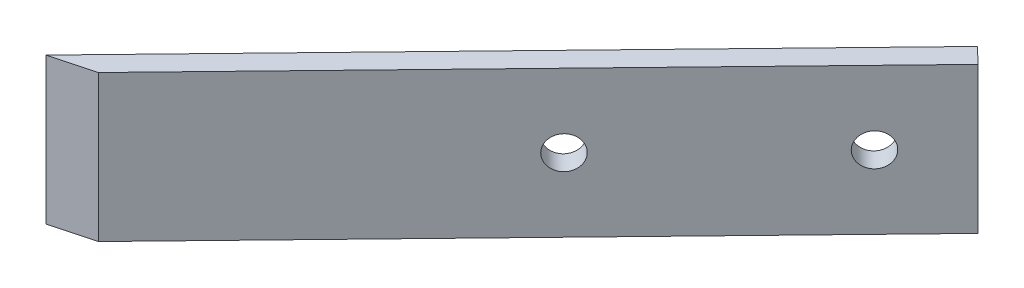
ISO-10303-21;
HEADER;
FILE_DESCRIPTION(('STEP AP214'),'2;1');
FILE_NAME('part.step','',(''),(''),'','','');
FILE_SCHEMA(('AUTOMOTIVE_DESIGN { 1 0 10303 214 1 1 1 1 }'));
ENDSEC;
DATA;
#1=APPLICATION_CONTEXT('core data for automotive mechanical design processes');
#2=APPLICATION_PROTOCOL_DEFINITION('international standard','automotive_design',2000,#1);
#3=PRODUCT_CONTEXT('',#1,'mechanical');
#4=PRODUCT('Part','Part','',(#3));
#5=PRODUCT_RELATED_PRODUCT_CATEGORY('part','',(#4));
#6=PRODUCT_DEFINITION_FORMATION('','',#4);
#7=PRODUCT_DEFINITION_CONTEXT('part definition',#1,'design');
#8=PRODUCT_DEFINITION('design','',#6,#7);
#9=PRODUCT_DEFINITION_SHAPE('','',#8);
#10=(LENGTH_UNIT() NAMED_UNIT(*) SI_UNIT(.MILLI.,.METRE.));
#11=(NAMED_UNIT(*) PLANE_ANGLE_UNIT() SI_UNIT($,.RADIAN.));
#12=(NAMED_UNIT(*) SI_UNIT($,.STERADIAN.) SOLID_ANGLE_UNIT());
#13=UNCERTAINTY_MEASURE_WITH_UNIT(LENGTH_MEASURE(1.E-05),#10,'distance_accuracy_value','');
#14=(GEOMETRIC_REPRESENTATION_CONTEXT(3) GLOBAL_UNCERTAINTY_ASSIGNED_CONTEXT((#13)) GLOBAL_UNIT_ASSIGNED_CONTEXT((#10,
#11,#12)) REPRESENTATION_CONTEXT('',''));
#15=CARTESIAN_POINT('',(0.,0.,0.));
#16=DIRECTION('',(0.,0.,1.));
#17=DIRECTION('',(1.,0.,0.));
#18=AXIS2_PLACEMENT_3D('',#15,#16,#17);
#19=CARTESIAN_POINT('',(-830.5061192892,-2000.,2737.529525084));
#20=DIRECTION('',(-0.718373918296144,0.,-0.69565718102514));
#21=DIRECTION('',(-0.69565718102514,0.,0.718373918296145));
#22=AXIS2_PLACEMENT_3D('',#19,#20,#21);
#23=CYLINDRICAL_SURFACE('',#22,4.5);
#24=CARTESIAN_POINT('',(-830.4342818974,-2000.,2737.599090802));
#25=DIRECTION('',(-0.718373918296144,0.,-0.69565718102514));
#26=DIRECTION('',(-0.69565718102514,0.,0.718373918296145));
#27=AXIS2_PLACEMENT_3D('',#24,#25,#26);
#28=CIRCLE('',#27,4.5);
#29=CARTESIAN_POINT('',(-833.564739212,-2000.,2740.831773434));
#30=VERTEX_POINT('',#29);
#31=EDGE_CURVE('E123',#30,#30,#28,.T.);
#32=ORIENTED_EDGE('',*,*,#31,.T.);
#33=DIRECTION('',(0.718373918296145,0.,0.69565718102514));
#34=VECTOR('',#33,1.);
#35=CARTESIAN_POINT('',(-833.6365766039,-2000.,2740.762207716));
#36=LINE('',#35,#34);
#37=CARTESIAN_POINT('',(-829.2544957022,-2000.,2745.00571652));
#38=VERTEX_POINT('',#37);
#39=EDGE_CURVE('E11',#30,#38,#36,.T.);
#40=ORIENTED_EDGE('',*,*,#39,.T.);
#41=CARTESIAN_POINT('',(-826.1240383876,-2000.,2741.773033888));
#42=DIRECTION('',(-0.718373918296144,0.,-0.69565718102514));
#43=DIRECTION('',(-0.69565718102514,0.,0.718373918296145));
#44=AXIS2_PLACEMENT_3D('',#41,#42,#43);
#45=CIRCLE('',#44,4.5);
#46=EDGE_CURVE('E143',#38,#38,#45,.T.);
#47=ORIENTED_EDGE('',*,*,#46,.F.);
#48=ORIENTED_EDGE('',*,*,#39,.F.);
#49=EDGE_LOOP('',(#32,#40,#47,#48));
#50=FACE_BOUND('',#49,.T.);
#51=ADVANCED_FACE('F17',(#50),#23,.F.);
#52=CARTESIAN_POINT('',(-788.7666884277,-2000.,2694.427089986));
#53=DIRECTION('',(-0.718373918296144,0.,-0.69565718102514));
#54=DIRECTION('',(-0.69565718102514,0.,0.718373918296145));
#55=AXIS2_PLACEMENT_3D('',#52,#53,#54);
#56=CYLINDRICAL_SURFACE('',#55,4.5);
#57=CARTESIAN_POINT('',(-788.6948510359,-2000.,2694.496655704));
#58=DIRECTION('',(-0.718373918296144,0.,-0.69565718102514));
#59=DIRECTION('',(-0.69565718102514,0.,0.718373918296145));
#60=AXIS2_PLACEMENT_3D('',#57,#58,#59);
#61=CIRCLE('',#60,4.5);
#62=CARTESIAN_POINT('',(-791.8253083505,-2000.,2697.729338336));
#63=VERTEX_POINT('',#62);
#64=EDGE_CURVE('E130',#63,#63,#61,.T.);
#65=ORIENTED_EDGE('',*,*,#64,.T.);
#66=DIRECTION('',(0.718373918296145,0.,0.69565718102514));
#67=VECTOR('',#66,1.);
#68=CARTESIAN_POINT('',(-791.8971457423,-2000.,2697.659772618));
#69=LINE('',#68,#67);
#70=CARTESIAN_POINT('',(-787.5150648407,-2000.,2701.903281422));
#71=VERTEX_POINT('',#70);
#72=EDGE_CURVE('E26',#63,#71,#69,.T.);
#73=ORIENTED_EDGE('',*,*,#72,.T.);
#74=CARTESIAN_POINT('',(-784.3846075261,-2000.,2698.67059879));
#75=DIRECTION('',(-0.718373918296144,0.,-0.69565718102514));
#76=DIRECTION('',(-0.69565718102514,0.,0.718373918296145));
#77=AXIS2_PLACEMENT_3D('',#74,#75,#76);
#78=CIRCLE('',#77,4.5);
#79=EDGE_CURVE('E128',#71,#71,#78,.T.);
#80=ORIENTED_EDGE('',*,*,#79,.F.);
#81=ORIENTED_EDGE('',*,*,#72,.F.);
#82=EDGE_LOOP('',(#65,#73,#80,#81));
#83=FACE_BOUND('',#82,.T.);
#84=ADVANCED_FACE('F169',(#83),#56,.F.);
#85=CARTESIAN_POINT('',(-46.716837641,0.,2580.799948362));
#86=DIRECTION('',(-0.258819045102985,0.,-0.965925826288944));
#87=DIRECTION('',(-0.965925826288944,0.,0.258819045102985));
#88=AXIS2_PLACEMENT_3D('',#85,#86,#87);
#89=PLANE('',#88);
#90=DIRECTION('',(0.,1.,0.));
#91=VECTOR('',#90,1.);
#92=CARTESIAN_POINT('',(-888.7212350275,-990.,2806.414346665));
#93=LINE('',#92,#91);
#94=CARTESIAN_POINT('',(-888.7212350275,-2020.,2806.414346665));
#95=VERTEX_POINT('',#94);
#96=CARTESIAN_POINT('',(-888.7212350275,-1980.,2806.414346665));
#97=VERTEX_POINT('',#96);
#98=EDGE_CURVE('E126',#95,#97,#93,.T.);
#99=ORIENTED_EDGE('',*,*,#98,.T.);
#100=DIRECTION('',(0.965925826288944,0.,-0.258819045102985));
#101=VECTOR('',#100,1.);
#102=CARTESIAN_POINT('',(-398.7798769135,-1980.,2675.13495542));
#103=LINE('',#102,#101);
#104=CARTESIAN_POINT('',(-900.,-1980.,2809.436482631));
#105=VERTEX_POINT('',#104);
#106=EDGE_CURVE('E94',#105,#97,#103,.T.);
#107=ORIENTED_EDGE('',*,*,#106,.F.);
#108=DIRECTION('',(0.,-1.,0.));
#109=VECTOR('',#108,1.);
#110=CARTESIAN_POINT('',(-900.,-1980.,2809.436482631));
#111=LINE('',#110,#109);
#112=CARTESIAN_POINT('',(-900.,-2020.,2809.436482631));
#113=VERTEX_POINT('',#112);
#114=EDGE_CURVE('E133',#105,#113,#111,.T.);
#115=ORIENTED_EDGE('',*,*,#114,.T.);
#116=DIRECTION('',(0.965925826288944,0.,-0.258819045102985));
#117=VECTOR('',#116,1.);
#118=CARTESIAN_POINT('',(-398.7798769135,-2020.,2675.13495542));
#119=LINE('',#118,#117);
#120=EDGE_CURVE('E147',#113,#95,#119,.T.);
#121=ORIENTED_EDGE('',*,*,#120,.T.);
#122=EDGE_LOOP('',(#99,#107,#115,#121));
#123=FACE_BOUND('',#122,.T.);
#124=ADVANCED_FACE('F19',(#123),#89,.F.);
#125=CARTESIAN_POINT('',(-774.7817074154,-1980.,2680.129177338));
#126=DIRECTION('',(0.718373918296145,0.,0.69565718102514));
#127=DIRECTION('',(0.,-1.,0.));
#128=AXIS2_PLACEMENT_3D('',#125,#126,#127);
#129=PLANE('',#128);
#130=ORIENTED_EDGE('',*,*,#31,.F.);
#131=EDGE_LOOP('',(#130));
#132=FACE_BOUND('',#131,.T.);
#133=ORIENTED_EDGE('',*,*,#64,.F.);
#134=EDGE_LOOP('',(#133));
#135=FACE_BOUND('',#134,.T.);
#136=DIRECTION('',(-0.69565718102514,0.,0.718373918296145));
#137=VECTOR('',#136,1.);
#138=CARTESIAN_POINT('',(-774.7817074154,-2020.,2680.129177338));
#139=LINE('',#138,#137);
#140=CARTESIAN_POINT('',(-774.7817074154,-2020.,2680.129177338));
#141=VERTEX_POINT('',#140);
#142=EDGE_CURVE('E150',#141,#113,#139,.T.);
#143=ORIENTED_EDGE('',*,*,#142,.T.);
#144=ORIENTED_EDGE('',*,*,#114,.F.);
#145=DIRECTION('',(-0.69565718102514,0.,0.718373918296145));
#146=VECTOR('',#145,1.);
#147=CARTESIAN_POINT('',(-774.7817074154,-1980.,2680.129177338));
#148=LINE('',#147,#146);
#149=CARTESIAN_POINT('',(-774.7817074154,-1980.,2680.129177338));
#150=VERTEX_POINT('',#149);
#151=EDGE_CURVE('E99',#150,#105,#148,.T.);
#152=ORIENTED_EDGE('',*,*,#151,.F.);
#153=DIRECTION('',(0.,-1.,0.));
#154=VECTOR('',#153,1.);
#155=CARTESIAN_POINT('',(-774.7817074154,-1980.,2680.129177338));
#156=LINE('',#155,#154);
#157=EDGE_CURVE('E107',#150,#141,#156,.T.);
#158=ORIENTED_EDGE('',*,*,#157,.T.);
#159=EDGE_LOOP('',(#143,#144,#152,#158));
#160=FACE_BOUND('',#159,.T.);
#161=ADVANCED_FACE('F159',(#132,#135,#160),#129,.F.);
#162=CARTESIAN_POINT('',(-774.7817074154,-2020.,2680.129177338));
#163=DIRECTION('',(0.,-1.,0.));
#164=DIRECTION('',(0.,0.,-1.));
#165=AXIS2_PLACEMENT_3D('',#162,#163,#164);
#166=PLANE('',#165);
#167=ORIENTED_EDGE('',*,*,#120,.F.);
#168=ORIENTED_EDGE('',*,*,#142,.F.);
#169=DIRECTION('',(0.718373918296145,0.,0.69565718102514));
#170=VECTOR('',#169,1.);
#171=CARTESIAN_POINT('',(-774.7817074154,-2020.,2680.129177338));
#172=LINE('',#171,#170);
#173=CARTESIAN_POINT('',(-770.4714639056,-2020.,2684.303120424));
#174=VERTEX_POINT('',#173);
#175=EDGE_CURVE('E115',#141,#174,#172,.T.);
#176=ORIENTED_EDGE('',*,*,#175,.T.);
#177=DIRECTION('',(-0.69565718102514,0.,0.718373918296145));
#178=VECTOR('',#177,1.);
#179=CARTESIAN_POINT('',(-770.4714639056,-2020.,2684.303120424));
#180=LINE('',#179,#178);
#181=EDGE_CURVE('E112',#174,#95,#180,.T.);
#182=ORIENTED_EDGE('',*,*,#181,.T.);
#183=EDGE_LOOP('',(#167,#168,#176,#182));
#184=FACE_BOUND('',#183,.T.);
#185=ADVANCED_FACE('F162',(#184),#166,.T.);
#186=CARTESIAN_POINT('',(-770.4714639056,-1980.,2684.303120424));
#187=DIRECTION('',(0.718373918296145,0.,0.69565718102514));
#188=DIRECTION('',(0.,-1.,0.));
#189=AXIS2_PLACEMENT_3D('',#186,#187,#188);
#190=PLANE('',#189);
#191=ORIENTED_EDGE('',*,*,#46,.T.);
#192=EDGE_LOOP('',(#191));
#193=FACE_BOUND('',#192,.T.);
#194=ORIENTED_EDGE('',*,*,#79,.T.);
#195=EDGE_LOOP('',(#194));
#196=FACE_BOUND('',#195,.T.);
#197=ORIENTED_EDGE('',*,*,#181,.F.);
#198=DIRECTION('',(0.,-1.,0.));
#199=VECTOR('',#198,1.);
#200=CARTESIAN_POINT('',(-770.4714639056,-1980.,2684.303120424));
#201=LINE('',#200,#199);
#202=CARTESIAN_POINT('',(-770.4714639056,-1980.,2684.303120424));
#203=VERTEX_POINT('',#202);
#204=EDGE_CURVE('E105',#203,#174,#201,.T.);
#205=ORIENTED_EDGE('',*,*,#204,.F.);
#206=DIRECTION('',(-0.69565718102514,0.,0.718373918296145));
#207=VECTOR('',#206,1.);
#208=CARTESIAN_POINT('',(-770.4714639056,-1980.,2684.303120424));
#209=LINE('',#208,#207);
#210=EDGE_CURVE('E87',#203,#97,#209,.T.);
#211=ORIENTED_EDGE('',*,*,#210,.T.);
#212=ORIENTED_EDGE('',*,*,#98,.F.);
#213=EDGE_LOOP('',(#197,#205,#211,#212));
#214=FACE_BOUND('',#213,.T.);
#215=ADVANCED_FACE('F110',(#193,#196,#214),#190,.T.);
#216=CARTESIAN_POINT('',(-774.7817074154,-1980.,2680.129177338));
#217=DIRECTION('',(0.,-1.,0.));
#218=DIRECTION('',(0.,0.,-1.));
#219=AXIS2_PLACEMENT_3D('',#216,#217,#218);
#220=PLANE('',#219);
#221=ORIENTED_EDGE('',*,*,#210,.F.);
#222=DIRECTION('',(0.718373918296145,0.,0.69565718102514));
#223=VECTOR('',#222,1.);
#224=CARTESIAN_POINT('',(-774.7817074154,-1980.,2680.129177338));
#225=LINE('',#224,#223);
#226=EDGE_CURVE('E91',#150,#203,#225,.T.);
#227=ORIENTED_EDGE('',*,*,#226,.F.);
#228=ORIENTED_EDGE('',*,*,#151,.T.);
#229=ORIENTED_EDGE('',*,*,#106,.T.);
#230=EDGE_LOOP('',(#221,#227,#228,#229));
#231=FACE_BOUND('',#230,.T.);
#232=ADVANCED_FACE('F89',(#231),#220,.F.);
#233=CARTESIAN_POINT('',(-774.7817074154,-1980.,2680.129177338));
#234=DIRECTION('',(-0.69565718102514,0.,0.718373918296145));
#235=DIRECTION('',(0.,1.,0.));
#236=AXIS2_PLACEMENT_3D('',#233,#234,#235);
#237=PLANE('',#236);
#238=ORIENTED_EDGE('',*,*,#204,.T.);
#239=ORIENTED_EDGE('',*,*,#175,.F.);
#240=ORIENTED_EDGE('',*,*,#157,.F.);
#241=ORIENTED_EDGE('',*,*,#226,.T.);
#242=EDGE_LOOP('',(#238,#239,#240,#241));
#243=FACE_BOUND('',#242,.T.);
#244=ADVANCED_FACE('F103',(#243),#237,.F.);
#245=CLOSED_SHELL('',(#51,#84,#124,#161,#185,#215,#232,#244));
#246=MANIFOLD_SOLID_BREP('B1',#245);
#247=ADVANCED_BREP_SHAPE_REPRESENTATION('',(#18,#246),#14);
#248=SHAPE_DEFINITION_REPRESENTATION(#9,#247);
ENDSEC;
END-ISO-10303-21;
